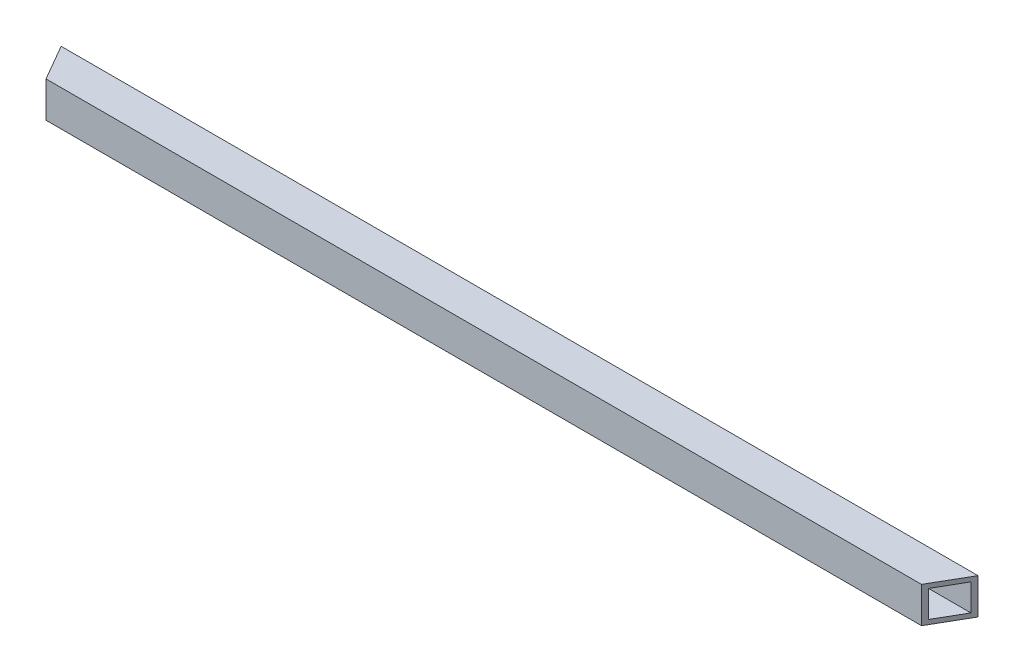
ISO-10303-21;
HEADER;
FILE_DESCRIPTION(('STEP AP214'),'2;1');
FILE_NAME('part.step','',(''),(''),'','','');
FILE_SCHEMA(('AUTOMOTIVE_DESIGN { 1 0 10303 214 1 1 1 1 }'));
ENDSEC;
DATA;
#1=APPLICATION_CONTEXT('core data for automotive mechanical design processes');
#2=APPLICATION_PROTOCOL_DEFINITION('international standard','automotive_design',2000,#1);
#3=PRODUCT_CONTEXT('',#1,'mechanical');
#4=PRODUCT('Part','Part','',(#3));
#5=PRODUCT_RELATED_PRODUCT_CATEGORY('part','',(#4));
#6=PRODUCT_DEFINITION_FORMATION('','',#4);
#7=PRODUCT_DEFINITION_CONTEXT('part definition',#1,'design');
#8=PRODUCT_DEFINITION('design','',#6,#7);
#9=PRODUCT_DEFINITION_SHAPE('','',#8);
#10=(LENGTH_UNIT() NAMED_UNIT(*) SI_UNIT(.MILLI.,.METRE.));
#11=(NAMED_UNIT(*) PLANE_ANGLE_UNIT() SI_UNIT($,.RADIAN.));
#12=(NAMED_UNIT(*) SI_UNIT($,.STERADIAN.) SOLID_ANGLE_UNIT());
#13=UNCERTAINTY_MEASURE_WITH_UNIT(LENGTH_MEASURE(1.E-05),#10,'distance_accuracy_value','');
#14=(GEOMETRIC_REPRESENTATION_CONTEXT(3) GLOBAL_UNCERTAINTY_ASSIGNED_CONTEXT((#13)) GLOBAL_UNIT_ASSIGNED_CONTEXT((#10,
#11,#12)) REPRESENTATION_CONTEXT('',''));
#15=CARTESIAN_POINT('',(0.,0.,0.));
#16=DIRECTION('',(0.,0.,1.));
#17=DIRECTION('',(1.,0.,0.));
#18=AXIS2_PLACEMENT_3D('',#15,#16,#17);
#19=CARTESIAN_POINT('',(-620.942858777788,0.,711.2));
#20=DIRECTION('',(0.,0.,1.));
#21=DIRECTION('',(1.,0.,0.));
#22=AXIS2_PLACEMENT_3D('',#19,#20,#21);
#23=PLANE('',#22);
#24=DIRECTION('',(1.,0.,0.));
#25=VECTOR('',#24,1.);
#26=CARTESIAN_POINT('',(0.,50.8,711.2));
#27=LINE('',#26,#25);
#28=CARTESIAN_POINT('',(-620.942858777541,50.8,711.200000000004));
#29=VERTEX_POINT('',#28);
#30=CARTESIAN_POINT('',(620.942858777788,50.8,711.2));
#31=VERTEX_POINT('',#30);
#32=EDGE_CURVE('E137',#29,#31,#27,.T.);
#33=ORIENTED_EDGE('',*,*,#32,.F.);
#34=DIRECTION('',(0.,1.,0.));
#35=VECTOR('',#34,1.);
#36=CARTESIAN_POINT('',(-620.942858777547,0.,711.200000000008));
#37=LINE('',#36,#35);
#38=CARTESIAN_POINT('',(-620.942858777537,0.,711.200000000002));
#39=VERTEX_POINT('',#38);
#40=EDGE_CURVE('E104',#39,#29,#37,.T.);
#41=ORIENTED_EDGE('',*,*,#40,.F.);
#42=DIRECTION('',(1.,0.,0.));
#43=VECTOR('',#42,1.);
#44=CARTESIAN_POINT('',(0.,0.,711.2));
#45=LINE('',#44,#43);
#46=CARTESIAN_POINT('',(620.942858777788,0.,711.2));
#47=VERTEX_POINT('',#46);
#48=EDGE_CURVE('E88',#39,#47,#45,.T.);
#49=ORIENTED_EDGE('',*,*,#48,.T.);
#50=DIRECTION('',(0.,1.,0.));
#51=VECTOR('',#50,1.);
#52=CARTESIAN_POINT('',(620.942858777788,0.,711.2));
#53=LINE('',#52,#51);
#54=EDGE_CURVE('E127',#31,#47,#53,.F.);
#55=ORIENTED_EDGE('',*,*,#54,.F.);
#56=EDGE_LOOP('',(#33,#41,#49,#55));
#57=FACE_BOUND('',#56,.T.);
#58=ADVANCED_FACE('F16',(#57),#23,.T.);
#59=CARTESIAN_POINT('',(0.,6.35,0.));
#60=DIRECTION('',(0.,1.,0.));
#61=DIRECTION('',(0.,0.,1.));
#62=AXIS2_PLACEMENT_3D('',#59,#60,#61);
#63=PLANE('',#62);
#64=DIRECTION('',(0.500000000000017,0.,-0.866025403784429));
#65=VECTOR('',#64,1.);
#66=CARTESIAN_POINT('',(620.942858777788,6.35,711.2));
#67=LINE('',#66,#65);
#68=CARTESIAN_POINT('',(646.606078243229,6.35,666.750000000005));
#69=VERTEX_POINT('',#68);
#70=CARTESIAN_POINT('',(624.609032986989,6.35,704.85000000002));
#71=VERTEX_POINT('',#70);
#72=EDGE_CURVE('E84',#69,#71,#67,.F.);
#73=ORIENTED_EDGE('',*,*,#72,.F.);
#74=DIRECTION('',(-1.,0.,0.));
#75=VECTOR('',#74,1.);
#76=CARTESIAN_POINT('',(650.272252452386,6.35,666.75));
#77=LINE('',#76,#75);
#78=CARTESIAN_POINT('',(-646.606078243185,6.35,666.74999999998));
#79=VERTEX_POINT('',#78);
#80=EDGE_CURVE('E77',#69,#79,#77,.T.);
#81=ORIENTED_EDGE('',*,*,#80,.T.);
#82=DIRECTION('',(0.500000000000017,0.,0.866025403784429));
#83=VECTOR('',#82,1.);
#84=CARTESIAN_POINT('',(-650.272252452386,6.35,660.4));
#85=LINE('',#84,#83);
#86=CARTESIAN_POINT('',(-624.609032986945,6.35,704.849999999995));
#87=VERTEX_POINT('',#86);
#88=EDGE_CURVE('E81',#87,#79,#85,.F.);
#89=ORIENTED_EDGE('',*,*,#88,.F.);
#90=DIRECTION('',(1.,0.,0.));
#91=VECTOR('',#90,1.);
#92=CARTESIAN_POINT('',(-620.942858777788,6.35,704.85));
#93=LINE('',#92,#91);
#94=EDGE_CURVE('E19',#87,#71,#93,.T.);
#95=ORIENTED_EDGE('',*,*,#94,.T.);
#96=EDGE_LOOP('',(#73,#81,#89,#95));
#97=FACE_BOUND('',#96,.T.);
#98=ADVANCED_FACE('F79',(#97),#63,.T.);
#99=CARTESIAN_POINT('',(-620.942858777788,0.,704.85));
#100=DIRECTION('',(0.,0.,1.));
#101=DIRECTION('',(1.,0.,0.));
#102=AXIS2_PLACEMENT_3D('',#99,#100,#101);
#103=PLANE('',#102);
#104=DIRECTION('',(1.,0.,0.));
#105=VECTOR('',#104,1.);
#106=CARTESIAN_POINT('',(0.,44.45,704.85));
#107=LINE('',#106,#105);
#108=CARTESIAN_POINT('',(-624.609032986945,44.45,704.849999999995));
#109=VERTEX_POINT('',#108);
#110=CARTESIAN_POINT('',(624.609032986989,44.45,704.85000000002));
#111=VERTEX_POINT('',#110);
#112=EDGE_CURVE('E113',#109,#111,#107,.T.);
#113=ORIENTED_EDGE('',*,*,#112,.T.);
#114=DIRECTION('',(0.,1.,0.));
#115=VECTOR('',#114,1.);
#116=CARTESIAN_POINT('',(624.609032987095,0.,704.850000000082));
#117=LINE('',#116,#115);
#118=EDGE_CURVE('E118',#71,#111,#117,.T.);
#119=ORIENTED_EDGE('',*,*,#118,.F.);
#120=ORIENTED_EDGE('',*,*,#94,.F.);
#121=DIRECTION('',(0.,1.,0.));
#122=VECTOR('',#121,1.);
#123=CARTESIAN_POINT('',(-624.609032986918,0.,704.849999999979));
#124=LINE('',#123,#122);
#125=EDGE_CURVE('E103',#109,#87,#124,.F.);
#126=ORIENTED_EDGE('',*,*,#125,.F.);
#127=EDGE_LOOP('',(#113,#119,#120,#126));
#128=FACE_BOUND('',#127,.T.);
#129=ADVANCED_FACE('F119',(#128),#103,.F.);
#130=CARTESIAN_POINT('',(0.,44.45,0.));
#131=DIRECTION('',(0.,1.,0.));
#132=DIRECTION('',(0.,0.,1.));
#133=AXIS2_PLACEMENT_3D('',#130,#131,#132);
#134=PLANE('',#133);
#135=DIRECTION('',(-1.,0.,0.));
#136=VECTOR('',#135,1.);
#137=CARTESIAN_POINT('',(650.272252452386,44.45,666.75));
#138=LINE('',#137,#136);
#139=CARTESIAN_POINT('',(-646.606078243185,44.45,666.74999999998));
#140=VERTEX_POINT('',#139);
#141=CARTESIAN_POINT('',(646.606078243229,44.45,666.750000000005));
#142=VERTEX_POINT('',#141);
#143=EDGE_CURVE('E89',#140,#142,#138,.F.);
#144=ORIENTED_EDGE('',*,*,#143,.T.);
#145=DIRECTION('',(0.500000000000017,0.,-0.866025403784429));
#146=VECTOR('',#145,1.);
#147=CARTESIAN_POINT('',(620.942858777788,44.45,711.2));
#148=LINE('',#147,#146);
#149=EDGE_CURVE('E122',#111,#142,#148,.T.);
#150=ORIENTED_EDGE('',*,*,#149,.F.);
#151=ORIENTED_EDGE('',*,*,#112,.F.);
#152=DIRECTION('',(0.500000000000017,0.,0.866025403784429));
#153=VECTOR('',#152,1.);
#154=CARTESIAN_POINT('',(-650.272252452386,44.45,660.4));
#155=LINE('',#154,#153);
#156=EDGE_CURVE('E97',#140,#109,#155,.T.);
#157=ORIENTED_EDGE('',*,*,#156,.F.);
#158=EDGE_LOOP('',(#144,#150,#151,#157));
#159=FACE_BOUND('',#158,.T.);
#160=ADVANCED_FACE('F143',(#159),#134,.F.);
#161=CARTESIAN_POINT('',(650.272252452386,0.,666.75));
#162=DIRECTION('',(0.,0.,-1.));
#163=DIRECTION('',(-1.,0.,0.));
#164=AXIS2_PLACEMENT_3D('',#161,#162,#163);
#165=PLANE('',#164);
#166=ORIENTED_EDGE('',*,*,#80,.F.);
#167=DIRECTION('',(0.,1.,0.));
#168=VECTOR('',#167,1.);
#169=CARTESIAN_POINT('',(646.606078243256,0.,666.750000000021));
#170=LINE('',#169,#168);
#171=EDGE_CURVE('E126',#142,#69,#170,.F.);
#172=ORIENTED_EDGE('',*,*,#171,.F.);
#173=ORIENTED_EDGE('',*,*,#143,.F.);
#174=DIRECTION('',(0.,1.,0.));
#175=VECTOR('',#174,1.);
#176=CARTESIAN_POINT('',(-646.606078243079,0.,666.749999999918));
#177=LINE('',#176,#175);
#178=EDGE_CURVE('E92',#79,#140,#177,.T.);
#179=ORIENTED_EDGE('',*,*,#178,.F.);
#180=EDGE_LOOP('',(#166,#172,#173,#179));
#181=FACE_BOUND('',#180,.T.);
#182=ADVANCED_FACE('F93',(#181),#165,.F.);
#183=CARTESIAN_POINT('',(0.,0.,0.));
#184=DIRECTION('',(0.,1.,0.));
#185=DIRECTION('',(0.,0.,1.));
#186=AXIS2_PLACEMENT_3D('',#183,#184,#185);
#187=PLANE('',#186);
#188=DIRECTION('',(-1.,0.,0.));
#189=VECTOR('',#188,1.);
#190=CARTESIAN_POINT('',(650.272252452386,0.,660.4));
#191=LINE('',#190,#189);
#192=CARTESIAN_POINT('',(650.272252452637,0.,660.399999999998));
#193=VERTEX_POINT('',#192);
#194=CARTESIAN_POINT('',(-650.272252452386,0.,660.4));
#195=VERTEX_POINT('',#194);
#196=EDGE_CURVE('E144',#193,#195,#191,.T.);
#197=ORIENTED_EDGE('',*,*,#196,.F.);
#198=DIRECTION('',(0.500000000000017,0.,-0.866025403784429));
#199=VECTOR('',#198,1.);
#200=CARTESIAN_POINT('',(620.942858777788,0.,711.2));
#201=LINE('',#200,#199);
#202=EDGE_CURVE('E134',#47,#193,#201,.T.);
#203=ORIENTED_EDGE('',*,*,#202,.F.);
#204=ORIENTED_EDGE('',*,*,#48,.F.);
#205=DIRECTION('',(0.500000000000017,0.,0.866025403784429));
#206=VECTOR('',#205,1.);
#207=CARTESIAN_POINT('',(-650.272252452386,0.,660.4));
#208=LINE('',#207,#206);
#209=EDGE_CURVE('E106',#195,#39,#208,.T.);
#210=ORIENTED_EDGE('',*,*,#209,.F.);
#211=EDGE_LOOP('',(#197,#203,#204,#210));
#212=FACE_BOUND('',#211,.T.);
#213=ADVANCED_FACE('F164',(#212),#187,.F.);
#214=CARTESIAN_POINT('',(-650.272252452386,0.,660.4));
#215=DIRECTION('',(-0.866025403784429,0.,0.500000000000017));
#216=DIRECTION('',(0.500000000000017,0.,0.866025403784429));
#217=AXIS2_PLACEMENT_3D('',#214,#215,#216);
#218=PLANE('',#217);
#219=ORIENTED_EDGE('',*,*,#156,.T.);
#220=ORIENTED_EDGE('',*,*,#125,.T.);
#221=ORIENTED_EDGE('',*,*,#88,.T.);
#222=ORIENTED_EDGE('',*,*,#178,.T.);
#223=EDGE_LOOP('',(#219,#220,#221,#222));
#224=FACE_BOUND('',#223,.T.);
#225=DIRECTION('',(0.500000000000243,0.,0.866025403784298));
#226=VECTOR('',#225,1.);
#227=CARTESIAN_POINT('',(-650.272252452386,50.8,660.4));
#228=LINE('',#227,#226);
#229=CARTESIAN_POINT('',(-650.272252452386,50.8,660.4));
#230=VERTEX_POINT('',#229);
#231=EDGE_CURVE('E139',#230,#29,#228,.T.);
#232=ORIENTED_EDGE('',*,*,#231,.F.);
#233=DIRECTION('',(0.,1.,0.));
#234=VECTOR('',#233,1.);
#235=CARTESIAN_POINT('',(-650.272252452386,0.,660.4));
#236=LINE('',#235,#234);
#237=EDGE_CURVE('E149',#195,#230,#236,.T.);
#238=ORIENTED_EDGE('',*,*,#237,.F.);
#239=ORIENTED_EDGE('',*,*,#209,.T.);
#240=ORIENTED_EDGE('',*,*,#40,.T.);
#241=EDGE_LOOP('',(#232,#238,#239,#240));
#242=FACE_BOUND('',#241,.T.);
#243=ADVANCED_FACE('F100',(#224,#242),#218,.T.);
#244=CARTESIAN_POINT('',(0.,50.8,0.));
#245=DIRECTION('',(0.,1.,0.));
#246=DIRECTION('',(0.,0.,1.));
#247=AXIS2_PLACEMENT_3D('',#244,#245,#246);
#248=PLANE('',#247);
#249=DIRECTION('',(0.500000000000017,0.,-0.866025403784429));
#250=VECTOR('',#249,1.);
#251=CARTESIAN_POINT('',(620.942858777788,50.8,711.2));
#252=LINE('',#251,#250);
#253=CARTESIAN_POINT('',(650.272252452637,50.8,660.399999999998));
#254=VERTEX_POINT('',#253);
#255=EDGE_CURVE('E34',#254,#31,#252,.F.);
#256=ORIENTED_EDGE('',*,*,#255,.F.);
#257=DIRECTION('',(-1.,0.,0.));
#258=VECTOR('',#257,1.);
#259=CARTESIAN_POINT('',(650.272252452386,50.8,660.4));
#260=LINE('',#259,#258);
#261=EDGE_CURVE('E25',#230,#254,#260,.F.);
#262=ORIENTED_EDGE('',*,*,#261,.F.);
#263=ORIENTED_EDGE('',*,*,#231,.T.);
#264=ORIENTED_EDGE('',*,*,#32,.T.);
#265=EDGE_LOOP('',(#256,#262,#263,#264));
#266=FACE_BOUND('',#265,.T.);
#267=ADVANCED_FACE('F156',(#266),#248,.T.);
#268=CARTESIAN_POINT('',(620.942858777788,0.,711.2));
#269=DIRECTION('',(0.866025403784429,0.,0.500000000000017));
#270=DIRECTION('',(0.500000000000017,0.,-0.866025403784429));
#271=AXIS2_PLACEMENT_3D('',#268,#269,#270);
#272=PLANE('',#271);
#273=ORIENTED_EDGE('',*,*,#149,.T.);
#274=ORIENTED_EDGE('',*,*,#171,.T.);
#275=ORIENTED_EDGE('',*,*,#72,.T.);
#276=ORIENTED_EDGE('',*,*,#118,.T.);
#277=EDGE_LOOP('',(#273,#274,#275,#276));
#278=FACE_BOUND('',#277,.T.);
#279=ORIENTED_EDGE('',*,*,#255,.T.);
#280=ORIENTED_EDGE('',*,*,#54,.T.);
#281=ORIENTED_EDGE('',*,*,#202,.T.);
#282=DIRECTION('',(0.,1.,0.));
#283=VECTOR('',#282,1.);
#284=CARTESIAN_POINT('',(650.27225245264,0.,660.4));
#285=LINE('',#284,#283);
#286=EDGE_CURVE('E11',#254,#193,#285,.F.);
#287=ORIENTED_EDGE('',*,*,#286,.F.);
#288=EDGE_LOOP('',(#279,#280,#281,#287));
#289=FACE_BOUND('',#288,.T.);
#290=ADVANCED_FACE('F124',(#278,#289),#272,.T.);
#291=CARTESIAN_POINT('',(650.272252452386,0.,660.4));
#292=DIRECTION('',(0.,0.,-1.));
#293=DIRECTION('',(-1.,0.,0.));
#294=AXIS2_PLACEMENT_3D('',#291,#292,#293);
#295=PLANE('',#294);
#296=ORIENTED_EDGE('',*,*,#261,.T.);
#297=ORIENTED_EDGE('',*,*,#286,.T.);
#298=ORIENTED_EDGE('',*,*,#196,.T.);
#299=ORIENTED_EDGE('',*,*,#237,.T.);
#300=EDGE_LOOP('',(#296,#297,#298,#299));
#301=FACE_BOUND('',#300,.T.);
#302=ADVANCED_FACE('F154',(#301),#295,.T.);
#303=CLOSED_SHELL('',(#58,#98,#129,#160,#182,#213,#243,#267,#290,#302));
#304=MANIFOLD_SOLID_BREP('B1',#303);
#305=ADVANCED_BREP_SHAPE_REPRESENTATION('',(#18,#304),#14);
#306=SHAPE_DEFINITION_REPRESENTATION(#9,#305);
ENDSEC;
END-ISO-10303-21;
